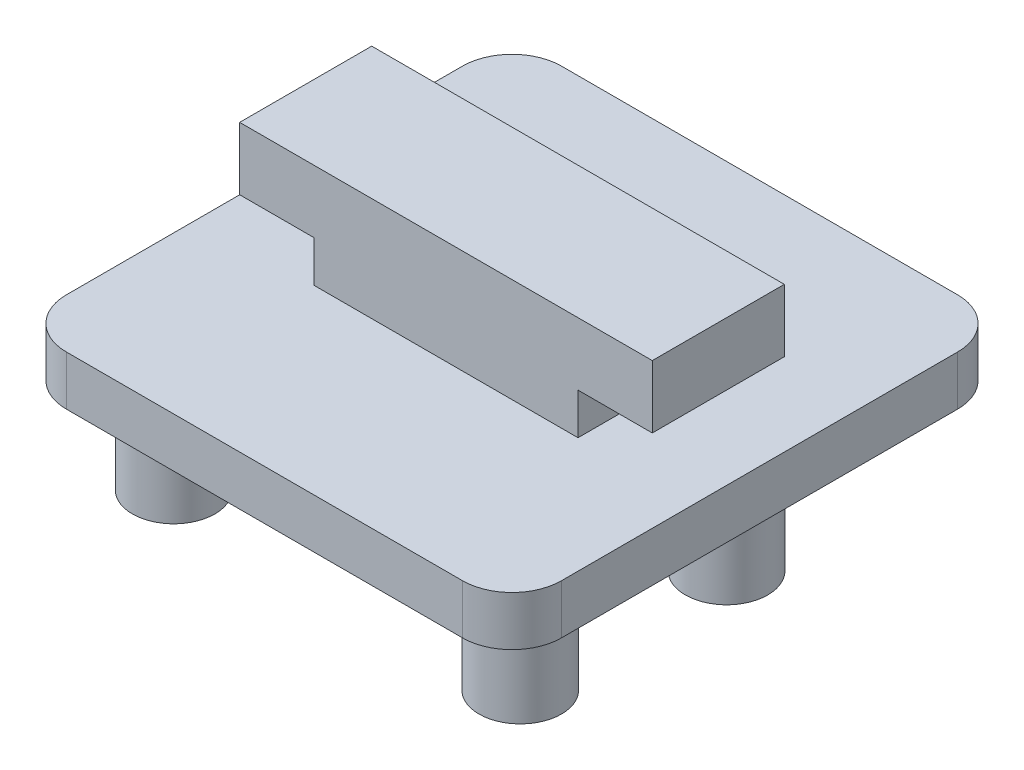
ISO-10303-21;
HEADER;
FILE_DESCRIPTION(('STEP AP214'),'2;1');
FILE_NAME('part.step','',(''),(''),'','','');
FILE_SCHEMA(('AUTOMOTIVE_DESIGN { 1 0 10303 214 1 1 1 1 }'));
ENDSEC;
DATA;
#1=APPLICATION_CONTEXT('core data for automotive mechanical design processes');
#2=APPLICATION_PROTOCOL_DEFINITION('international standard','automotive_design',2000,#1);
#3=PRODUCT_CONTEXT('',#1,'mechanical');
#4=PRODUCT('Part','Part','',(#3));
#5=PRODUCT_RELATED_PRODUCT_CATEGORY('part','',(#4));
#6=PRODUCT_DEFINITION_FORMATION('','',#4);
#7=PRODUCT_DEFINITION_CONTEXT('part definition',#1,'design');
#8=PRODUCT_DEFINITION('design','',#6,#7);
#9=PRODUCT_DEFINITION_SHAPE('','',#8);
#10=(LENGTH_UNIT() NAMED_UNIT(*) SI_UNIT(.MILLI.,.METRE.));
#11=(NAMED_UNIT(*) PLANE_ANGLE_UNIT() SI_UNIT($,.RADIAN.));
#12=(NAMED_UNIT(*) SI_UNIT($,.STERADIAN.) SOLID_ANGLE_UNIT());
#13=UNCERTAINTY_MEASURE_WITH_UNIT(LENGTH_MEASURE(1.E-05),#10,'distance_accuracy_value','');
#14=(GEOMETRIC_REPRESENTATION_CONTEXT(3) GLOBAL_UNCERTAINTY_ASSIGNED_CONTEXT((#13)) GLOBAL_UNIT_ASSIGNED_CONTEXT((#10,
#11,#12)) REPRESENTATION_CONTEXT('',''));
#15=CARTESIAN_POINT('',(0.,0.,0.));
#16=DIRECTION('',(0.,0.,1.));
#17=DIRECTION('',(1.,0.,0.));
#18=AXIS2_PLACEMENT_3D('',#15,#16,#17);
#19=CARTESIAN_POINT('',(2.92154730395577,3.,-2.83145688648393));
#20=DIRECTION('',(0.,-1.,0.));
#21=DIRECTION('',(0.,0.,-1.));
#22=AXIS2_PLACEMENT_3D('',#19,#20,#21);
#23=CYLINDRICAL_SURFACE('',#22,3.00000000000001);
#24=CARTESIAN_POINT('',(2.92154730395577,0.,-2.83145688648393));
#25=DIRECTION('',(0.,1.,0.));
#26=DIRECTION('',(0.,0.,1.));
#27=AXIS2_PLACEMENT_3D('',#24,#25,#26);
#28=CIRCLE('',#27,3.00000000000001);
#29=CARTESIAN_POINT('',(2.92154730395578,0.,0.168543113516079));
#30=VERTEX_POINT('',#29);
#31=CARTESIAN_POINT('',(5.92154730395578,0.,-2.83145688648392));
#32=VERTEX_POINT('',#31);
#33=EDGE_CURVE('E243',#30,#32,#28,.T.);
#34=ORIENTED_EDGE('',*,*,#33,.T.);
#35=DIRECTION('',(0.,-1.,0.));
#36=VECTOR('',#35,1.);
#37=CARTESIAN_POINT('',(5.92154730395578,3.,-2.83145688648392));
#38=LINE('',#37,#36);
#39=CARTESIAN_POINT('',(5.92154730395578,3.,-2.83145688648392));
#40=VERTEX_POINT('',#39);
#41=EDGE_CURVE('E300',#40,#32,#38,.T.);
#42=ORIENTED_EDGE('',*,*,#41,.F.);
#43=CARTESIAN_POINT('',(2.92154730395577,3.,-2.83145688648393));
#44=DIRECTION('',(0.,1.,0.));
#45=DIRECTION('',(0.,0.,1.));
#46=AXIS2_PLACEMENT_3D('',#43,#44,#45);
#47=CIRCLE('',#46,3.00000000000001);
#48=CARTESIAN_POINT('',(2.92154730395578,3.,0.168543113516079));
#49=VERTEX_POINT('',#48);
#50=EDGE_CURVE('E246',#49,#40,#47,.T.);
#51=ORIENTED_EDGE('',*,*,#50,.F.);
#52=DIRECTION('',(0.,-1.,0.));
#53=VECTOR('',#52,1.);
#54=CARTESIAN_POINT('',(2.92154730395578,3.,0.168543113516079));
#55=LINE('',#54,#53);
#56=EDGE_CURVE('E264',#49,#30,#55,.T.);
#57=ORIENTED_EDGE('',*,*,#56,.T.);
#58=EDGE_LOOP('',(#34,#42,#51,#57));
#59=FACE_BOUND('',#58,.T.);
#60=ADVANCED_FACE('F43',(#59),#23,.T.);
#61=CARTESIAN_POINT('',(5.92154730395578,3.,-2.83145688648392));
#62=DIRECTION('',(-1.,0.,0.));
#63=DIRECTION('',(0.,0.,1.));
#64=AXIS2_PLACEMENT_3D('',#61,#62,#63);
#65=PLANE('',#64);
#66=DIRECTION('',(0.,0.,-1.));
#67=VECTOR('',#66,1.);
#68=CARTESIAN_POINT('',(5.92154730395578,0.,-2.83145688648392));
#69=LINE('',#68,#67);
#70=CARTESIAN_POINT('',(5.92154730395578,0.,-26.8314568864839));
#71=VERTEX_POINT('',#70);
#72=EDGE_CURVE('E267',#32,#71,#69,.T.);
#73=ORIENTED_EDGE('',*,*,#72,.T.);
#74=DIRECTION('',(0.,-1.,0.));
#75=VECTOR('',#74,1.);
#76=CARTESIAN_POINT('',(5.92154730395578,3.,-26.8314568864839));
#77=LINE('',#76,#75);
#78=CARTESIAN_POINT('',(5.92154730395578,3.,-26.8314568864839));
#79=VERTEX_POINT('',#78);
#80=EDGE_CURVE('E297',#79,#71,#77,.T.);
#81=ORIENTED_EDGE('',*,*,#80,.F.);
#82=DIRECTION('',(0.,0.,-1.));
#83=VECTOR('',#82,1.);
#84=CARTESIAN_POINT('',(5.92154730395578,3.,-2.83145688648392));
#85=LINE('',#84,#83);
#86=EDGE_CURVE('E249',#40,#79,#85,.T.);
#87=ORIENTED_EDGE('',*,*,#86,.F.);
#88=ORIENTED_EDGE('',*,*,#41,.T.);
#89=EDGE_LOOP('',(#73,#81,#87,#88));
#90=FACE_BOUND('',#89,.T.);
#91=ADVANCED_FACE('F362',(#90),#65,.F.);
#92=CARTESIAN_POINT('',(2.92154730395577,3.,-26.8314568864839));
#93=DIRECTION('',(0.,-1.,0.));
#94=DIRECTION('',(0.,0.,-1.));
#95=AXIS2_PLACEMENT_3D('',#92,#93,#94);
#96=CYLINDRICAL_SURFACE('',#95,3.);
#97=CARTESIAN_POINT('',(2.92154730395577,0.,-26.8314568864839));
#98=DIRECTION('',(0.,1.,0.));
#99=DIRECTION('',(0.,0.,1.));
#100=AXIS2_PLACEMENT_3D('',#97,#98,#99);
#101=CIRCLE('',#100,3.);
#102=CARTESIAN_POINT('',(2.92154730395578,0.,-29.8314568864839));
#103=VERTEX_POINT('',#102);
#104=EDGE_CURVE('E269',#71,#103,#101,.T.);
#105=ORIENTED_EDGE('',*,*,#104,.T.);
#106=DIRECTION('',(0.,-1.,0.));
#107=VECTOR('',#106,1.);
#108=CARTESIAN_POINT('',(2.92154730395578,3.,-29.8314568864839));
#109=LINE('',#108,#107);
#110=CARTESIAN_POINT('',(2.92154730395578,3.,-29.8314568864839));
#111=VERTEX_POINT('',#110);
#112=EDGE_CURVE('E294',#111,#103,#109,.T.);
#113=ORIENTED_EDGE('',*,*,#112,.F.);
#114=CARTESIAN_POINT('',(2.92154730395577,3.,-26.8314568864839));
#115=DIRECTION('',(0.,1.,0.));
#116=DIRECTION('',(0.,0.,1.));
#117=AXIS2_PLACEMENT_3D('',#114,#115,#116);
#118=CIRCLE('',#117,3.);
#119=EDGE_CURVE('E252',#79,#111,#118,.T.);
#120=ORIENTED_EDGE('',*,*,#119,.F.);
#121=ORIENTED_EDGE('',*,*,#80,.T.);
#122=EDGE_LOOP('',(#105,#113,#120,#121));
#123=FACE_BOUND('',#122,.T.);
#124=ADVANCED_FACE('F358',(#123),#96,.T.);
#125=CARTESIAN_POINT('',(-21.0784526960442,3.,-29.8314568864839));
#126=DIRECTION('',(0.,0.,1.));
#127=DIRECTION('',(1.,0.,0.));
#128=AXIS2_PLACEMENT_3D('',#125,#126,#127);
#129=PLANE('',#128);
#130=DIRECTION('',(-1.,0.,0.));
#131=VECTOR('',#130,1.);
#132=CARTESIAN_POINT('',(-21.0784526960442,0.,-29.8314568864839));
#133=LINE('',#132,#131);
#134=CARTESIAN_POINT('',(-21.0784526960442,0.,-29.8314568864839));
#135=VERTEX_POINT('',#134);
#136=EDGE_CURVE('E271',#103,#135,#133,.T.);
#137=ORIENTED_EDGE('',*,*,#136,.T.);
#138=DIRECTION('',(0.,-1.,0.));
#139=VECTOR('',#138,1.);
#140=CARTESIAN_POINT('',(-21.0784526960442,3.,-29.8314568864839));
#141=LINE('',#140,#139);
#142=CARTESIAN_POINT('',(-21.0784526960442,3.,-29.8314568864839));
#143=VERTEX_POINT('',#142);
#144=EDGE_CURVE('E291',#143,#135,#141,.T.);
#145=ORIENTED_EDGE('',*,*,#144,.F.);
#146=DIRECTION('',(-1.,0.,0.));
#147=VECTOR('',#146,1.);
#148=CARTESIAN_POINT('',(-21.0784526960442,3.,-29.8314568864839));
#149=LINE('',#148,#147);
#150=EDGE_CURVE('E254',#111,#143,#149,.T.);
#151=ORIENTED_EDGE('',*,*,#150,.F.);
#152=ORIENTED_EDGE('',*,*,#112,.T.);
#153=EDGE_LOOP('',(#137,#145,#151,#152));
#154=FACE_BOUND('',#153,.T.);
#155=ADVANCED_FACE('F355',(#154),#129,.F.);
#156=CARTESIAN_POINT('',(-21.0784526960442,3.,-26.8314568864839));
#157=DIRECTION('',(0.,-1.,0.));
#158=DIRECTION('',(0.,0.,-1.));
#159=AXIS2_PLACEMENT_3D('',#156,#157,#158);
#160=CYLINDRICAL_SURFACE('',#159,3.);
#161=CARTESIAN_POINT('',(-21.0784526960442,0.,-26.8314568864839));
#162=DIRECTION('',(0.,1.,0.));
#163=DIRECTION('',(0.,0.,-1.));
#164=AXIS2_PLACEMENT_3D('',#161,#162,#163);
#165=CIRCLE('',#164,3.);
#166=CARTESIAN_POINT('',(-24.0784526960442,0.,-26.8314568864839));
#167=VERTEX_POINT('',#166);
#168=EDGE_CURVE('E273',#135,#167,#165,.T.);
#169=ORIENTED_EDGE('',*,*,#168,.T.);
#170=DIRECTION('',(0.,-1.,0.));
#171=VECTOR('',#170,1.);
#172=CARTESIAN_POINT('',(-24.0784526960442,3.,-26.8314568864839));
#173=LINE('',#172,#171);
#174=CARTESIAN_POINT('',(-24.0784526960442,3.,-26.8314568864839));
#175=VERTEX_POINT('',#174);
#176=EDGE_CURVE('E288',#175,#167,#173,.T.);
#177=ORIENTED_EDGE('',*,*,#176,.F.);
#178=CARTESIAN_POINT('',(-21.0784526960442,3.,-26.8314568864839));
#179=DIRECTION('',(0.,1.,0.));
#180=DIRECTION('',(0.,0.,-1.));
#181=AXIS2_PLACEMENT_3D('',#178,#179,#180);
#182=CIRCLE('',#181,3.);
#183=EDGE_CURVE('E256',#143,#175,#182,.T.);
#184=ORIENTED_EDGE('',*,*,#183,.F.);
#185=ORIENTED_EDGE('',*,*,#144,.T.);
#186=EDGE_LOOP('',(#169,#177,#184,#185));
#187=FACE_BOUND('',#186,.T.);
#188=ADVANCED_FACE('F351',(#187),#160,.T.);
#189=CARTESIAN_POINT('',(-24.0784526960442,3.,-26.8314568864839));
#190=DIRECTION('',(1.,0.,0.));
#191=DIRECTION('',(0.,0.,-1.));
#192=AXIS2_PLACEMENT_3D('',#189,#190,#191);
#193=PLANE('',#192);
#194=DIRECTION('',(0.,0.,1.));
#195=VECTOR('',#194,1.);
#196=CARTESIAN_POINT('',(-24.0784526960442,0.,-26.8314568864839));
#197=LINE('',#196,#195);
#198=CARTESIAN_POINT('',(-24.0784526960442,0.,-2.83145688648392));
#199=VERTEX_POINT('',#198);
#200=EDGE_CURVE('E275',#167,#199,#197,.T.);
#201=ORIENTED_EDGE('',*,*,#200,.T.);
#202=DIRECTION('',(0.,-1.,0.));
#203=VECTOR('',#202,1.);
#204=CARTESIAN_POINT('',(-24.0784526960442,3.,-2.83145688648392));
#205=LINE('',#204,#203);
#206=CARTESIAN_POINT('',(-24.0784526960442,3.,-2.83145688648392));
#207=VERTEX_POINT('',#206);
#208=EDGE_CURVE('E285',#207,#199,#205,.T.);
#209=ORIENTED_EDGE('',*,*,#208,.F.);
#210=DIRECTION('',(0.,0.,1.));
#211=VECTOR('',#210,1.);
#212=CARTESIAN_POINT('',(-24.0784526960442,3.,-26.8314568864839));
#213=LINE('',#212,#211);
#214=EDGE_CURVE('E258',#175,#207,#213,.T.);
#215=ORIENTED_EDGE('',*,*,#214,.F.);
#216=ORIENTED_EDGE('',*,*,#176,.T.);
#217=EDGE_LOOP('',(#201,#209,#215,#216));
#218=FACE_BOUND('',#217,.T.);
#219=ADVANCED_FACE('F346',(#218),#193,.F.);
#220=CARTESIAN_POINT('',(-21.0784526960442,3.,-2.83145688648393));
#221=DIRECTION('',(0.,-1.,0.));
#222=DIRECTION('',(0.,0.,-1.));
#223=AXIS2_PLACEMENT_3D('',#220,#221,#222);
#224=CYLINDRICAL_SURFACE('',#223,3.00000000000001);
#225=CARTESIAN_POINT('',(-21.0784526960442,0.,-2.83145688648393));
#226=DIRECTION('',(0.,1.,0.));
#227=DIRECTION('',(0.,0.,1.));
#228=AXIS2_PLACEMENT_3D('',#225,#226,#227);
#229=CIRCLE('',#228,3.00000000000001);
#230=CARTESIAN_POINT('',(-21.0784526960442,0.,0.168543113516078));
#231=VERTEX_POINT('',#230);
#232=EDGE_CURVE('E277',#199,#231,#229,.T.);
#233=ORIENTED_EDGE('',*,*,#232,.T.);
#234=DIRECTION('',(0.,-1.,0.));
#235=VECTOR('',#234,1.);
#236=CARTESIAN_POINT('',(-21.0784526960442,3.,0.168543113516078));
#237=LINE('',#236,#235);
#238=CARTESIAN_POINT('',(-21.0784526960442,3.,0.168543113516078));
#239=VERTEX_POINT('',#238);
#240=EDGE_CURVE('E282',#239,#231,#237,.T.);
#241=ORIENTED_EDGE('',*,*,#240,.F.);
#242=CARTESIAN_POINT('',(-21.0784526960442,3.,-2.83145688648393));
#243=DIRECTION('',(0.,1.,0.));
#244=DIRECTION('',(0.,0.,1.));
#245=AXIS2_PLACEMENT_3D('',#242,#243,#244);
#246=CIRCLE('',#245,3.00000000000001);
#247=EDGE_CURVE('E260',#207,#239,#246,.T.);
#248=ORIENTED_EDGE('',*,*,#247,.F.);
#249=ORIENTED_EDGE('',*,*,#208,.T.);
#250=EDGE_LOOP('',(#233,#241,#248,#249));
#251=FACE_BOUND('',#250,.T.);
#252=ADVANCED_FACE('F340',(#251),#224,.T.);
#253=CARTESIAN_POINT('',(-21.0784526960442,3.,0.168543113516079));
#254=DIRECTION('',(0.,0.,-1.));
#255=DIRECTION('',(-1.,0.,0.));
#256=AXIS2_PLACEMENT_3D('',#253,#254,#255);
#257=PLANE('',#256);
#258=DIRECTION('',(1.,0.,0.));
#259=VECTOR('',#258,1.);
#260=CARTESIAN_POINT('',(-21.0784526960442,0.,0.168543113516079));
#261=LINE('',#260,#259);
#262=EDGE_CURVE('E250',#231,#30,#261,.T.);
#263=ORIENTED_EDGE('',*,*,#262,.T.);
#264=ORIENTED_EDGE('',*,*,#56,.F.);
#265=DIRECTION('',(1.,0.,0.));
#266=VECTOR('',#265,1.);
#267=CARTESIAN_POINT('',(-21.0784526960442,3.,0.168543113516079));
#268=LINE('',#267,#266);
#269=EDGE_CURVE('E262',#239,#49,#268,.T.);
#270=ORIENTED_EDGE('',*,*,#269,.F.);
#271=ORIENTED_EDGE('',*,*,#240,.T.);
#272=EDGE_LOOP('',(#263,#264,#270,#271));
#273=FACE_BOUND('',#272,.T.);
#274=ADVANCED_FACE('F336',(#273),#257,.F.);
#275=CARTESIAN_POINT('',(2.92154730395577,3.,-2.83145688648393));
#276=DIRECTION('',(0.,1.,0.));
#277=DIRECTION('',(0.,0.,1.));
#278=AXIS2_PLACEMENT_3D('',#275,#276,#277);
#279=PLANE('',#278);
#280=DIRECTION('',(1.,0.,0.));
#281=VECTOR('',#280,1.);
#282=CARTESIAN_POINT('',(-1.07845269604421,3.,-10.8314568864839));
#283=LINE('',#282,#281);
#284=CARTESIAN_POINT('',(-17.0784526960442,3.,-10.8314568864839));
#285=VERTEX_POINT('',#284);
#286=CARTESIAN_POINT('',(-1.07845269604421,3.,-10.8314568864839));
#287=VERTEX_POINT('',#286);
#288=EDGE_CURVE('E57',#285,#287,#283,.T.);
#289=ORIENTED_EDGE('',*,*,#288,.F.);
#290=DIRECTION('',(0.,0.,1.));
#291=VECTOR('',#290,1.);
#292=CARTESIAN_POINT('',(-17.0784526960442,3.,-10.8314568864839));
#293=LINE('',#292,#291);
#294=CARTESIAN_POINT('',(-17.0784526960442,3.,-18.8314568864839));
#295=VERTEX_POINT('',#294);
#296=EDGE_CURVE('E61',#295,#285,#293,.T.);
#297=ORIENTED_EDGE('',*,*,#296,.F.);
#298=DIRECTION('',(-1.,0.,0.));
#299=VECTOR('',#298,1.);
#300=CARTESIAN_POINT('',(-17.0784526960442,3.,-18.8314568864839));
#301=LINE('',#300,#299);
#302=CARTESIAN_POINT('',(-1.07845269604422,3.,-18.8314568864839));
#303=VERTEX_POINT('',#302);
#304=EDGE_CURVE('E195',#303,#295,#301,.T.);
#305=ORIENTED_EDGE('',*,*,#304,.F.);
#306=DIRECTION('',(0.,0.,-1.));
#307=VECTOR('',#306,1.);
#308=CARTESIAN_POINT('',(-1.07845269604422,3.,-18.8314568864839));
#309=LINE('',#308,#307);
#310=EDGE_CURVE('E180',#287,#303,#309,.T.);
#311=ORIENTED_EDGE('',*,*,#310,.F.);
#312=EDGE_LOOP('',(#289,#297,#305,#311));
#313=FACE_BOUND('',#312,.T.);
#314=ORIENTED_EDGE('',*,*,#50,.T.);
#315=ORIENTED_EDGE('',*,*,#86,.T.);
#316=ORIENTED_EDGE('',*,*,#119,.T.);
#317=ORIENTED_EDGE('',*,*,#150,.T.);
#318=ORIENTED_EDGE('',*,*,#183,.T.);
#319=ORIENTED_EDGE('',*,*,#214,.T.);
#320=ORIENTED_EDGE('',*,*,#247,.T.);
#321=ORIENTED_EDGE('',*,*,#269,.T.);
#322=EDGE_LOOP('',(#314,#315,#316,#317,#318,#319,#320,#321));
#323=FACE_BOUND('',#322,.T.);
#324=ADVANCED_FACE('F317',(#313,#323),#279,.T.);
#325=CARTESIAN_POINT('',(2.92154730395577,0.,-2.83145688648393));
#326=DIRECTION('',(0.,1.,0.));
#327=DIRECTION('',(0.,0.,1.));
#328=AXIS2_PLACEMENT_3D('',#325,#326,#327);
#329=PLANE('',#328);
#330=CARTESIAN_POINT('',(-19.5784526960442,0.,-4.83145688648392));
#331=DIRECTION('',(0.,1.,0.));
#332=DIRECTION('',(0.,0.,1.));
#333=AXIS2_PLACEMENT_3D('',#330,#331,#332);
#334=CIRCLE('',#333,2.5);
#335=CARTESIAN_POINT('',(-19.5784526960442,0.,-2.33145688648392));
#336=VERTEX_POINT('',#335);
#337=EDGE_CURVE('E12',#336,#336,#334,.F.);
#338=ORIENTED_EDGE('',*,*,#337,.F.);
#339=EDGE_LOOP('',(#338));
#340=FACE_BOUND('',#339,.T.);
#341=CARTESIAN_POINT('',(1.42154730395578,0.,-17.3314568864839));
#342=DIRECTION('',(0.,1.,0.));
#343=DIRECTION('',(0.,0.,1.));
#344=AXIS2_PLACEMENT_3D('',#341,#342,#343);
#345=CIRCLE('',#344,2.5);
#346=CARTESIAN_POINT('',(1.42154730395578,0.,-14.8314568864839));
#347=VERTEX_POINT('',#346);
#348=EDGE_CURVE('E50',#347,#347,#345,.F.);
#349=ORIENTED_EDGE('',*,*,#348,.F.);
#350=EDGE_LOOP('',(#349));
#351=FACE_BOUND('',#350,.T.);
#352=CARTESIAN_POINT('',(-19.5784526960442,0.,-17.3314568864839));
#353=DIRECTION('',(0.,1.,0.));
#354=DIRECTION('',(0.,0.,1.));
#355=AXIS2_PLACEMENT_3D('',#352,#353,#354);
#356=CIRCLE('',#355,2.5);
#357=CARTESIAN_POINT('',(-19.5784526960442,0.,-14.8314568864839));
#358=VERTEX_POINT('',#357);
#359=EDGE_CURVE('E306',#358,#358,#356,.F.);
#360=ORIENTED_EDGE('',*,*,#359,.F.);
#361=EDGE_LOOP('',(#360));
#362=FACE_BOUND('',#361,.T.);
#363=CARTESIAN_POINT('',(1.42154730395578,0.,-4.83145688648392));
#364=DIRECTION('',(0.,1.,0.));
#365=DIRECTION('',(0.,0.,1.));
#366=AXIS2_PLACEMENT_3D('',#363,#364,#365);
#367=CIRCLE('',#366,2.5);
#368=CARTESIAN_POINT('',(1.42154730395578,0.,-2.33145688648392));
#369=VERTEX_POINT('',#368);
#370=EDGE_CURVE('E303',#369,#369,#367,.F.);
#371=ORIENTED_EDGE('',*,*,#370,.F.);
#372=EDGE_LOOP('',(#371));
#373=FACE_BOUND('',#372,.T.);
#374=ORIENTED_EDGE('',*,*,#33,.F.);
#375=ORIENTED_EDGE('',*,*,#262,.F.);
#376=ORIENTED_EDGE('',*,*,#232,.F.);
#377=ORIENTED_EDGE('',*,*,#200,.F.);
#378=ORIENTED_EDGE('',*,*,#168,.F.);
#379=ORIENTED_EDGE('',*,*,#136,.F.);
#380=ORIENTED_EDGE('',*,*,#104,.F.);
#381=ORIENTED_EDGE('',*,*,#72,.F.);
#382=EDGE_LOOP('',(#374,#375,#376,#377,#378,#379,#380,#381));
#383=FACE_BOUND('',#382,.T.);
#384=ADVANCED_FACE('F313',(#340,#351,#362,#373,#383),#329,.F.);
#385=CARTESIAN_POINT('',(1.42154730395578,-6.,-4.83145688648392));
#386=DIRECTION('',(0.,1.,0.));
#387=DIRECTION('',(0.,0.,1.));
#388=AXIS2_PLACEMENT_3D('',#385,#386,#387);
#389=CYLINDRICAL_SURFACE('',#388,0.95);
#390=CARTESIAN_POINT('',(1.42154730395578,-6.,-4.83145688648392));
#391=DIRECTION('',(0.,-1.,0.));
#392=DIRECTION('',(0.,0.,-1.));
#393=AXIS2_PLACEMENT_3D('',#390,#391,#392);
#394=CIRCLE('',#393,0.95);
#395=CARTESIAN_POINT('',(1.42154730395578,-6.,-5.78145688648392));
#396=VERTEX_POINT('',#395);
#397=EDGE_CURVE('E237',#396,#396,#394,.T.);
#398=ORIENTED_EDGE('',*,*,#397,.T.);
#399=EDGE_LOOP('',(#398));
#400=FACE_BOUND('',#399,.T.);
#401=CARTESIAN_POINT('',(1.42154730395578,0.,-4.83145688648392));
#402=DIRECTION('',(0.,-1.,0.));
#403=DIRECTION('',(0.,0.,-1.));
#404=AXIS2_PLACEMENT_3D('',#401,#402,#403);
#405=CIRCLE('',#404,0.95);
#406=CARTESIAN_POINT('',(1.42154730395578,0.,-5.78145688648392));
#407=VERTEX_POINT('',#406);
#408=EDGE_CURVE('E231',#407,#407,#405,.T.);
#409=ORIENTED_EDGE('',*,*,#408,.F.);
#410=EDGE_LOOP('',(#409));
#411=FACE_BOUND('',#410,.T.);
#412=ADVANCED_FACE('F316',(#400,#411),#389,.F.);
#413=CARTESIAN_POINT('',(1.42154730395578,-6.,-4.83145688648392));
#414=DIRECTION('',(0.,1.,0.));
#415=DIRECTION('',(0.,0.,1.));
#416=AXIS2_PLACEMENT_3D('',#413,#414,#415);
#417=CYLINDRICAL_SURFACE('',#416,2.5);
#418=CARTESIAN_POINT('',(1.42154730395578,-6.,-4.83145688648392));
#419=DIRECTION('',(0.,-1.,0.));
#420=DIRECTION('',(0.,0.,-1.));
#421=AXIS2_PLACEMENT_3D('',#418,#419,#420);
#422=CIRCLE('',#421,2.5);
#423=CARTESIAN_POINT('',(1.42154730395578,-6.,-7.33145688648392));
#424=VERTEX_POINT('',#423);
#425=EDGE_CURVE('E240',#424,#424,#422,.T.);
#426=ORIENTED_EDGE('',*,*,#425,.F.);
#427=EDGE_LOOP('',(#426));
#428=FACE_BOUND('',#427,.T.);
#429=ORIENTED_EDGE('',*,*,#370,.T.);
#430=EDGE_LOOP('',(#429));
#431=FACE_BOUND('',#430,.T.);
#432=ADVANCED_FACE('F412',(#428,#431),#417,.T.);
#433=CARTESIAN_POINT('',(0.,-6.,0.));
#434=DIRECTION('',(0.,-1.,0.));
#435=DIRECTION('',(0.,0.,-1.));
#436=AXIS2_PLACEMENT_3D('',#433,#434,#435);
#437=PLANE('',#436);
#438=ORIENTED_EDGE('',*,*,#397,.F.);
#439=EDGE_LOOP('',(#438));
#440=FACE_BOUND('',#439,.T.);
#441=ORIENTED_EDGE('',*,*,#425,.T.);
#442=EDGE_LOOP('',(#441));
#443=FACE_BOUND('',#442,.T.);
#444=ADVANCED_FACE('F422',(#440,#443),#437,.T.);
#445=ORIENTED_EDGE('',*,*,#408,.T.);
#446=EDGE_LOOP('',(#445));
#447=FACE_BOUND('',#446,.T.);
#448=ADVANCED_FACE('F321',(#447),#329,.F.);
#449=CARTESIAN_POINT('',(-19.5784526960442,-6.,-17.3314568864839));
#450=DIRECTION('',(0.,1.,0.));
#451=DIRECTION('',(0.,0.,1.));
#452=AXIS2_PLACEMENT_3D('',#449,#450,#451);
#453=CYLINDRICAL_SURFACE('',#452,0.950000000000001);
#454=CARTESIAN_POINT('',(-19.5784526960442,-6.,-17.3314568864839));
#455=DIRECTION('',(0.,-1.,0.));
#456=DIRECTION('',(0.,0.,-1.));
#457=AXIS2_PLACEMENT_3D('',#454,#455,#456);
#458=CIRCLE('',#457,0.950000000000001);
#459=CARTESIAN_POINT('',(-19.5784526960442,-6.,-18.2814568864839));
#460=VERTEX_POINT('',#459);
#461=EDGE_CURVE('E232',#460,#460,#458,.T.);
#462=ORIENTED_EDGE('',*,*,#461,.T.);
#463=EDGE_LOOP('',(#462));
#464=FACE_BOUND('',#463,.T.);
#465=CARTESIAN_POINT('',(-19.5784526960442,0.,-17.3314568864839));
#466=DIRECTION('',(0.,-1.,0.));
#467=DIRECTION('',(0.,0.,-1.));
#468=AXIS2_PLACEMENT_3D('',#465,#466,#467);
#469=CIRCLE('',#468,0.950000000000001);
#470=CARTESIAN_POINT('',(-19.5784526960442,0.,-18.2814568864839));
#471=VERTEX_POINT('',#470);
#472=EDGE_CURVE('E228',#471,#471,#469,.T.);
#473=ORIENTED_EDGE('',*,*,#472,.F.);
#474=EDGE_LOOP('',(#473));
#475=FACE_BOUND('',#474,.T.);
#476=ADVANCED_FACE('F441',(#464,#475),#453,.F.);
#477=CARTESIAN_POINT('',(-19.5784526960442,-6.,-17.3314568864839));
#478=DIRECTION('',(0.,1.,0.));
#479=DIRECTION('',(0.,0.,1.));
#480=AXIS2_PLACEMENT_3D('',#477,#478,#479);
#481=CYLINDRICAL_SURFACE('',#480,2.5);
#482=CARTESIAN_POINT('',(-19.5784526960442,-6.,-17.3314568864839));
#483=DIRECTION('',(0.,-1.,0.));
#484=DIRECTION('',(0.,0.,-1.));
#485=AXIS2_PLACEMENT_3D('',#482,#483,#484);
#486=CIRCLE('',#485,2.5);
#487=CARTESIAN_POINT('',(-19.5784526960442,-6.,-19.8314568864839));
#488=VERTEX_POINT('',#487);
#489=EDGE_CURVE('E222',#488,#488,#486,.T.);
#490=ORIENTED_EDGE('',*,*,#489,.F.);
#491=EDGE_LOOP('',(#490));
#492=FACE_BOUND('',#491,.T.);
#493=ORIENTED_EDGE('',*,*,#359,.T.);
#494=EDGE_LOOP('',(#493));
#495=FACE_BOUND('',#494,.T.);
#496=ADVANCED_FACE('F451',(#492,#495),#481,.T.);
#497=CARTESIAN_POINT('',(0.,-6.,0.));
#498=DIRECTION('',(0.,-1.,0.));
#499=DIRECTION('',(0.,0.,-1.));
#500=AXIS2_PLACEMENT_3D('',#497,#498,#499);
#501=PLANE('',#500);
#502=ORIENTED_EDGE('',*,*,#461,.F.);
#503=EDGE_LOOP('',(#502));
#504=FACE_BOUND('',#503,.T.);
#505=ORIENTED_EDGE('',*,*,#489,.T.);
#506=EDGE_LOOP('',(#505));
#507=FACE_BOUND('',#506,.T.);
#508=ADVANCED_FACE('F461',(#504,#507),#501,.T.);
#509=ORIENTED_EDGE('',*,*,#472,.T.);
#510=EDGE_LOOP('',(#509));
#511=FACE_BOUND('',#510,.T.);
#512=ADVANCED_FACE('F443',(#511),#329,.F.);
#513=CARTESIAN_POINT('',(1.42154730395578,-6.,-17.3314568864839));
#514=DIRECTION('',(0.,1.,0.));
#515=DIRECTION('',(0.,0.,1.));
#516=AXIS2_PLACEMENT_3D('',#513,#514,#515);
#517=CYLINDRICAL_SURFACE('',#516,0.95);
#518=CARTESIAN_POINT('',(1.42154730395578,-6.,-17.3314568864839));
#519=DIRECTION('',(0.,-1.,0.));
#520=DIRECTION('',(0.,0.,-1.));
#521=AXIS2_PLACEMENT_3D('',#518,#519,#520);
#522=CIRCLE('',#521,0.95);
#523=CARTESIAN_POINT('',(1.42154730395578,-6.,-18.2814568864839));
#524=VERTEX_POINT('',#523);
#525=EDGE_CURVE('E223',#524,#524,#522,.T.);
#526=ORIENTED_EDGE('',*,*,#525,.T.);
#527=EDGE_LOOP('',(#526));
#528=FACE_BOUND('',#527,.T.);
#529=CARTESIAN_POINT('',(1.42154730395578,0.,-17.3314568864839));
#530=DIRECTION('',(0.,-1.,0.));
#531=DIRECTION('',(0.,0.,-1.));
#532=AXIS2_PLACEMENT_3D('',#529,#530,#531);
#533=CIRCLE('',#532,0.95);
#534=CARTESIAN_POINT('',(1.42154730395578,0.,-18.2814568864839));
#535=VERTEX_POINT('',#534);
#536=EDGE_CURVE('E219',#535,#535,#533,.T.);
#537=ORIENTED_EDGE('',*,*,#536,.F.);
#538=EDGE_LOOP('',(#537));
#539=FACE_BOUND('',#538,.T.);
#540=ADVANCED_FACE('F480',(#528,#539),#517,.F.);
#541=CARTESIAN_POINT('',(1.42154730395578,-6.,-17.3314568864839));
#542=DIRECTION('',(0.,1.,0.));
#543=DIRECTION('',(0.,0.,1.));
#544=AXIS2_PLACEMENT_3D('',#541,#542,#543);
#545=CYLINDRICAL_SURFACE('',#544,2.5);
#546=CARTESIAN_POINT('',(1.42154730395578,-6.,-17.3314568864839));
#547=DIRECTION('',(0.,-1.,0.));
#548=DIRECTION('',(0.,0.,-1.));
#549=AXIS2_PLACEMENT_3D('',#546,#547,#548);
#550=CIRCLE('',#549,2.5);
#551=CARTESIAN_POINT('',(1.42154730395578,-6.,-19.8314568864839));
#552=VERTEX_POINT('',#551);
#553=EDGE_CURVE('E216',#552,#552,#550,.T.);
#554=ORIENTED_EDGE('',*,*,#553,.F.);
#555=EDGE_LOOP('',(#554));
#556=FACE_BOUND('',#555,.T.);
#557=ORIENTED_EDGE('',*,*,#348,.T.);
#558=EDGE_LOOP('',(#557));
#559=FACE_BOUND('',#558,.T.);
#560=ADVANCED_FACE('F311',(#556,#559),#545,.T.);
#561=CARTESIAN_POINT('',(0.,-6.,0.));
#562=DIRECTION('',(0.,-1.,0.));
#563=DIRECTION('',(0.,0.,-1.));
#564=AXIS2_PLACEMENT_3D('',#561,#562,#563);
#565=PLANE('',#564);
#566=ORIENTED_EDGE('',*,*,#525,.F.);
#567=EDGE_LOOP('',(#566));
#568=FACE_BOUND('',#567,.T.);
#569=ORIENTED_EDGE('',*,*,#553,.T.);
#570=EDGE_LOOP('',(#569));
#571=FACE_BOUND('',#570,.T.);
#572=ADVANCED_FACE('F499',(#568,#571),#565,.T.);
#573=ORIENTED_EDGE('',*,*,#536,.T.);
#574=EDGE_LOOP('',(#573));
#575=FACE_BOUND('',#574,.T.);
#576=ADVANCED_FACE('F482',(#575),#329,.F.);
#577=CARTESIAN_POINT('',(-19.5784526960442,-6.,-4.83145688648392));
#578=DIRECTION('',(0.,-1.,0.));
#579=DIRECTION('',(0.,0.,-1.));
#580=AXIS2_PLACEMENT_3D('',#577,#578,#579);
#581=PLANE('',#580);
#582=CARTESIAN_POINT('',(-19.5784526960442,-6.,-4.83145688648392));
#583=DIRECTION('',(0.,-1.,0.));
#584=DIRECTION('',(0.,0.,-1.));
#585=AXIS2_PLACEMENT_3D('',#582,#583,#584);
#586=CIRCLE('',#585,2.5);
#587=CARTESIAN_POINT('',(-19.5784526960442,-6.,-7.33145688648392));
#588=VERTEX_POINT('',#587);
#589=EDGE_CURVE('E209',#588,#588,#586,.T.);
#590=ORIENTED_EDGE('',*,*,#589,.T.);
#591=EDGE_LOOP('',(#590));
#592=FACE_BOUND('',#591,.T.);
#593=CARTESIAN_POINT('',(-19.5784526960442,-6.,-4.83145688648392));
#594=DIRECTION('',(0.,-1.,0.));
#595=DIRECTION('',(0.,0.,-1.));
#596=AXIS2_PLACEMENT_3D('',#593,#594,#595);
#597=CIRCLE('',#596,0.973149492321348);
#598=CARTESIAN_POINT('',(-19.5784526960442,-6.,-5.80460637880527));
#599=VERTEX_POINT('',#598);
#600=EDGE_CURVE('E212',#599,#599,#597,.T.);
#601=ORIENTED_EDGE('',*,*,#600,.F.);
#602=EDGE_LOOP('',(#601));
#603=FACE_BOUND('',#602,.T.);
#604=ADVANCED_FACE('F518',(#592,#603),#581,.T.);
#605=CARTESIAN_POINT('',(-19.5784526960442,-6.,-4.83145688648392));
#606=DIRECTION('',(0.,1.,0.));
#607=DIRECTION('',(0.,0.,1.));
#608=AXIS2_PLACEMENT_3D('',#605,#606,#607);
#609=CYLINDRICAL_SURFACE('',#608,2.5);
#610=ORIENTED_EDGE('',*,*,#589,.F.);
#611=EDGE_LOOP('',(#610));
#612=FACE_BOUND('',#611,.T.);
#613=ORIENTED_EDGE('',*,*,#337,.T.);
#614=EDGE_LOOP('',(#613));
#615=FACE_BOUND('',#614,.T.);
#616=ADVANCED_FACE('F526',(#612,#615),#609,.T.);
#617=CARTESIAN_POINT('',(-19.5784526960442,-6.,-4.83145688648392));
#618=DIRECTION('',(0.,1.,0.));
#619=DIRECTION('',(0.,0.,1.));
#620=AXIS2_PLACEMENT_3D('',#617,#618,#619);
#621=CYLINDRICAL_SURFACE('',#620,0.973149492321348);
#622=ORIENTED_EDGE('',*,*,#600,.T.);
#623=EDGE_LOOP('',(#622));
#624=FACE_BOUND('',#623,.T.);
#625=CARTESIAN_POINT('',(-19.5784526960442,0.,-4.83145688648392));
#626=DIRECTION('',(0.,-1.,0.));
#627=DIRECTION('',(0.,0.,-1.));
#628=AXIS2_PLACEMENT_3D('',#625,#626,#627);
#629=CIRCLE('',#628,0.973149492321348);
#630=CARTESIAN_POINT('',(-19.5784526960442,0.,-5.80460637880527));
#631=VERTEX_POINT('',#630);
#632=EDGE_CURVE('E213',#631,#631,#629,.T.);
#633=ORIENTED_EDGE('',*,*,#632,.F.);
#634=EDGE_LOOP('',(#633));
#635=FACE_BOUND('',#634,.T.);
#636=ADVANCED_FACE('F536',(#624,#635),#621,.F.);
#637=ORIENTED_EDGE('',*,*,#632,.T.);
#638=EDGE_LOOP('',(#637));
#639=FACE_BOUND('',#638,.T.);
#640=ADVANCED_FACE('F320',(#639),#329,.F.);
#641=CARTESIAN_POINT('',(-1.07845269604421,5.5,-10.8314568864839));
#642=DIRECTION('',(0.,0.,-1.));
#643=DIRECTION('',(-1.,0.,0.));
#644=AXIS2_PLACEMENT_3D('',#641,#642,#643);
#645=PLANE('',#644);
#646=ORIENTED_EDGE('',*,*,#288,.T.);
#647=DIRECTION('',(0.,-1.,0.));
#648=VECTOR('',#647,1.);
#649=CARTESIAN_POINT('',(-1.07845269604421,5.5,-10.8314568864839));
#650=LINE('',#649,#648);
#651=CARTESIAN_POINT('',(-1.07845269604421,5.5,-10.8314568864839));
#652=VERTEX_POINT('',#651);
#653=EDGE_CURVE('E206',#652,#287,#650,.T.);
#654=ORIENTED_EDGE('',*,*,#653,.F.);
#655=DIRECTION('',(1.,0.,0.));
#656=VECTOR('',#655,1.);
#657=CARTESIAN_POINT('',(-21.5784526960442,5.5,-10.8314568864839));
#658=LINE('',#657,#656);
#659=CARTESIAN_POINT('',(3.42154730395578,5.5,-10.8314568864839));
#660=VERTEX_POINT('',#659);
#661=EDGE_CURVE('E652',#652,#660,#658,.T.);
#662=ORIENTED_EDGE('',*,*,#661,.T.);
#663=DIRECTION('',(0.,-1.,0.));
#664=VECTOR('',#663,1.);
#665=CARTESIAN_POINT('',(3.42154730395578,9.3,-10.8314568864839));
#666=LINE('',#665,#664);
#667=CARTESIAN_POINT('',(3.42154730395578,9.3,-10.8314568864839));
#668=VERTEX_POINT('',#667);
#669=EDGE_CURVE('E656',#668,#660,#666,.T.);
#670=ORIENTED_EDGE('',*,*,#669,.F.);
#671=DIRECTION('',(1.,0.,0.));
#672=VECTOR('',#671,1.);
#673=CARTESIAN_POINT('',(-21.5784526960442,9.3,-10.8314568864839));
#674=LINE('',#673,#672);
#675=CARTESIAN_POINT('',(-21.5784526960442,9.3,-10.8314568864839));
#676=VERTEX_POINT('',#675);
#677=EDGE_CURVE('E170',#676,#668,#674,.T.);
#678=ORIENTED_EDGE('',*,*,#677,.F.);
#679=DIRECTION('',(0.,-1.,0.));
#680=VECTOR('',#679,1.);
#681=CARTESIAN_POINT('',(-21.5784526960442,9.3,-10.8314568864839));
#682=LINE('',#681,#680);
#683=CARTESIAN_POINT('',(-21.5784526960442,5.5,-10.8314568864839));
#684=VERTEX_POINT('',#683);
#685=EDGE_CURVE('E182',#676,#684,#682,.T.);
#686=ORIENTED_EDGE('',*,*,#685,.T.);
#687=CARTESIAN_POINT('',(-17.0784526960442,5.5,-10.8314568864839));
#688=VERTEX_POINT('',#687);
#689=EDGE_CURVE('E174',#684,#688,#658,.T.);
#690=ORIENTED_EDGE('',*,*,#689,.T.);
#691=DIRECTION('',(0.,-1.,0.));
#692=VECTOR('',#691,1.);
#693=CARTESIAN_POINT('',(-17.0784526960442,5.5,-10.8314568864839));
#694=LINE('',#693,#692);
#695=EDGE_CURVE('E191',#688,#285,#694,.T.);
#696=ORIENTED_EDGE('',*,*,#695,.T.);
#697=EDGE_LOOP('',(#646,#654,#662,#670,#678,#686,#690,#696));
#698=FACE_BOUND('',#697,.T.);
#699=ADVANCED_FACE('F554',(#698),#645,.F.);
#700=CARTESIAN_POINT('',(-1.07845269604422,5.5,-18.8314568864839));
#701=DIRECTION('',(-1.,0.,0.));
#702=DIRECTION('',(0.,0.,1.));
#703=AXIS2_PLACEMENT_3D('',#700,#701,#702);
#704=PLANE('',#703);
#705=ORIENTED_EDGE('',*,*,#310,.T.);
#706=DIRECTION('',(0.,-1.,0.));
#707=VECTOR('',#706,1.);
#708=CARTESIAN_POINT('',(-1.07845269604422,5.5,-18.8314568864839));
#709=LINE('',#708,#707);
#710=CARTESIAN_POINT('',(-1.07845269604422,5.5,-18.8314568864839));
#711=VERTEX_POINT('',#710);
#712=EDGE_CURVE('E203',#711,#303,#709,.T.);
#713=ORIENTED_EDGE('',*,*,#712,.F.);
#714=DIRECTION('',(0.,0.,-1.));
#715=VECTOR('',#714,1.);
#716=CARTESIAN_POINT('',(-1.07845269604422,5.5,-18.8314568864839));
#717=LINE('',#716,#715);
#718=EDGE_CURVE('E186',#652,#711,#717,.T.);
#719=ORIENTED_EDGE('',*,*,#718,.F.);
#720=ORIENTED_EDGE('',*,*,#653,.T.);
#721=EDGE_LOOP('',(#705,#713,#719,#720));
#722=FACE_BOUND('',#721,.T.);
#723=ADVANCED_FACE('F567',(#722),#704,.F.);
#724=CARTESIAN_POINT('',(-17.0784526960442,5.5,-18.8314568864839));
#725=DIRECTION('',(0.,0.,1.));
#726=DIRECTION('',(1.,0.,0.));
#727=AXIS2_PLACEMENT_3D('',#724,#725,#726);
#728=PLANE('',#727);
#729=ORIENTED_EDGE('',*,*,#304,.T.);
#730=DIRECTION('',(0.,-1.,0.));
#731=VECTOR('',#730,1.);
#732=CARTESIAN_POINT('',(-17.0784526960442,5.5,-18.8314568864839));
#733=LINE('',#732,#731);
#734=CARTESIAN_POINT('',(-17.0784526960442,5.5,-18.8314568864839));
#735=VERTEX_POINT('',#734);
#736=EDGE_CURVE('E200',#735,#295,#733,.T.);
#737=ORIENTED_EDGE('',*,*,#736,.F.);
#738=DIRECTION('',(-1.,0.,0.));
#739=VECTOR('',#738,1.);
#740=CARTESIAN_POINT('',(-9.07845269604422,5.5,-18.8314568864839));
#741=LINE('',#740,#739);
#742=CARTESIAN_POINT('',(-21.5784526960442,5.5,-18.8314568864839));
#743=VERTEX_POINT('',#742);
#744=EDGE_CURVE('E664',#735,#743,#741,.T.);
#745=ORIENTED_EDGE('',*,*,#744,.T.);
#746=DIRECTION('',(0.,-1.,0.));
#747=VECTOR('',#746,1.);
#748=CARTESIAN_POINT('',(-21.5784526960442,9.3,-18.8314568864839));
#749=LINE('',#748,#747);
#750=CARTESIAN_POINT('',(-21.5784526960442,9.3,-18.8314568864839));
#751=VERTEX_POINT('',#750);
#752=EDGE_CURVE('E161',#751,#743,#749,.T.);
#753=ORIENTED_EDGE('',*,*,#752,.F.);
#754=DIRECTION('',(-1.,0.,0.));
#755=VECTOR('',#754,1.);
#756=CARTESIAN_POINT('',(3.42154730395578,9.3,-18.8314568864839));
#757=LINE('',#756,#755);
#758=CARTESIAN_POINT('',(3.42154730395578,9.3,-18.8314568864839));
#759=VERTEX_POINT('',#758);
#760=EDGE_CURVE('E153',#759,#751,#757,.T.);
#761=ORIENTED_EDGE('',*,*,#760,.F.);
#762=DIRECTION('',(0.,-1.,0.));
#763=VECTOR('',#762,1.);
#764=CARTESIAN_POINT('',(3.42154730395578,9.3,-18.8314568864839));
#765=LINE('',#764,#763);
#766=CARTESIAN_POINT('',(3.42154730395578,5.5,-18.8314568864839));
#767=VERTEX_POINT('',#766);
#768=EDGE_CURVE('E158',#759,#767,#765,.T.);
#769=ORIENTED_EDGE('',*,*,#768,.T.);
#770=EDGE_CURVE('E653',#767,#711,#741,.T.);
#771=ORIENTED_EDGE('',*,*,#770,.T.);
#772=ORIENTED_EDGE('',*,*,#712,.T.);
#773=EDGE_LOOP('',(#729,#737,#745,#753,#761,#769,#771,#772));
#774=FACE_BOUND('',#773,.T.);
#775=ADVANCED_FACE('F155',(#774),#728,.F.);
#776=CARTESIAN_POINT('',(-17.0784526960442,5.5,-10.8314568864839));
#777=DIRECTION('',(1.,0.,0.));
#778=DIRECTION('',(0.,0.,-1.));
#779=AXIS2_PLACEMENT_3D('',#776,#777,#778);
#780=PLANE('',#779);
#781=ORIENTED_EDGE('',*,*,#296,.T.);
#782=ORIENTED_EDGE('',*,*,#695,.F.);
#783=DIRECTION('',(0.,0.,1.));
#784=VECTOR('',#783,1.);
#785=CARTESIAN_POINT('',(-17.0784526960442,5.5,-10.8314568864839));
#786=LINE('',#785,#784);
#787=EDGE_CURVE('E189',#735,#688,#786,.T.);
#788=ORIENTED_EDGE('',*,*,#787,.F.);
#789=ORIENTED_EDGE('',*,*,#736,.T.);
#790=EDGE_LOOP('',(#781,#782,#788,#789));
#791=FACE_BOUND('',#790,.T.);
#792=ADVANCED_FACE('F589',(#791),#780,.F.);
#793=CARTESIAN_POINT('',(0.,5.5,0.));
#794=DIRECTION('',(0.,1.,0.));
#795=DIRECTION('',(0.,0.,1.));
#796=AXIS2_PLACEMENT_3D('',#793,#794,#795);
#797=PLANE('',#796);
#798=ORIENTED_EDGE('',*,*,#661,.F.);
#799=ORIENTED_EDGE('',*,*,#718,.T.);
#800=ORIENTED_EDGE('',*,*,#770,.F.);
#801=DIRECTION('',(0.,0.,-1.));
#802=VECTOR('',#801,1.);
#803=CARTESIAN_POINT('',(3.42154730395578,5.5,-10.8314568864839));
#804=LINE('',#803,#802);
#805=EDGE_CURVE('E178',#660,#767,#804,.T.);
#806=ORIENTED_EDGE('',*,*,#805,.F.);
#807=EDGE_LOOP('',(#798,#799,#800,#806));
#808=FACE_BOUND('',#807,.T.);
#809=ADVANCED_FACE('F598',(#808),#797,.F.);
#810=ORIENTED_EDGE('',*,*,#744,.F.);
#811=ORIENTED_EDGE('',*,*,#787,.T.);
#812=ORIENTED_EDGE('',*,*,#689,.F.);
#813=DIRECTION('',(0.,0.,1.));
#814=VECTOR('',#813,1.);
#815=CARTESIAN_POINT('',(-21.5784526960442,5.5,-18.8314568864839));
#816=LINE('',#815,#814);
#817=EDGE_CURVE('E648',#743,#684,#816,.T.);
#818=ORIENTED_EDGE('',*,*,#817,.F.);
#819=EDGE_LOOP('',(#810,#811,#812,#818));
#820=FACE_BOUND('',#819,.T.);
#821=ADVANCED_FACE('F607',(#820),#797,.F.);
#822=CARTESIAN_POINT('',(3.42154730395578,9.3,-10.8314568864839));
#823=DIRECTION('',(-1.,0.,0.));
#824=DIRECTION('',(0.,0.,1.));
#825=AXIS2_PLACEMENT_3D('',#822,#823,#824);
#826=PLANE('',#825);
#827=ORIENTED_EDGE('',*,*,#805,.T.);
#828=ORIENTED_EDGE('',*,*,#768,.F.);
#829=DIRECTION('',(0.,0.,-1.));
#830=VECTOR('',#829,1.);
#831=CARTESIAN_POINT('',(3.42154730395578,9.3,-10.8314568864839));
#832=LINE('',#831,#830);
#833=EDGE_CURVE('E165',#668,#759,#832,.T.);
#834=ORIENTED_EDGE('',*,*,#833,.F.);
#835=ORIENTED_EDGE('',*,*,#669,.T.);
#836=EDGE_LOOP('',(#827,#828,#834,#835));
#837=FACE_BOUND('',#836,.T.);
#838=ADVANCED_FACE('F176',(#837),#826,.F.);
#839=CARTESIAN_POINT('',(-21.5784526960442,9.3,-18.8314568864839));
#840=DIRECTION('',(1.,0.,0.));
#841=DIRECTION('',(0.,0.,-1.));
#842=AXIS2_PLACEMENT_3D('',#839,#840,#841);
#843=PLANE('',#842);
#844=ORIENTED_EDGE('',*,*,#817,.T.);
#845=ORIENTED_EDGE('',*,*,#685,.F.);
#846=DIRECTION('',(0.,0.,1.));
#847=VECTOR('',#846,1.);
#848=CARTESIAN_POINT('',(-21.5784526960442,9.3,-18.8314568864839));
#849=LINE('',#848,#847);
#850=EDGE_CURVE('E164',#751,#676,#849,.T.);
#851=ORIENTED_EDGE('',*,*,#850,.F.);
#852=ORIENTED_EDGE('',*,*,#752,.T.);
#853=EDGE_LOOP('',(#844,#845,#851,#852));
#854=FACE_BOUND('',#853,.T.);
#855=ADVANCED_FACE('F625',(#854),#843,.F.);
#856=CARTESIAN_POINT('',(0.,9.3,0.));
#857=DIRECTION('',(0.,1.,0.));
#858=DIRECTION('',(0.,0.,1.));
#859=AXIS2_PLACEMENT_3D('',#856,#857,#858);
#860=PLANE('',#859);
#861=ORIENTED_EDGE('',*,*,#833,.T.);
#862=ORIENTED_EDGE('',*,*,#760,.T.);
#863=ORIENTED_EDGE('',*,*,#850,.T.);
#864=ORIENTED_EDGE('',*,*,#677,.T.);
#865=EDGE_LOOP('',(#861,#862,#863,#864));
#866=FACE_BOUND('',#865,.T.);
#867=ADVANCED_FACE('F168',(#866),#860,.T.);
#868=CLOSED_SHELL('',(#60,#91,#124,#155,#188,#219,#252,#274,#324,#384,#412,#432,#444,#448,#476,
#496,#508,#512,#540,#560,#572,#576,#604,#616,#636,#640,#699,#723,#775,#792,#809,#821,#838,#855,#867));
#869=MANIFOLD_SOLID_BREP('B2',#868);
#870=ADVANCED_BREP_SHAPE_REPRESENTATION('',(#18,#869),#14);
#871=SHAPE_DEFINITION_REPRESENTATION(#9,#870);
ENDSEC;
END-ISO-10303-21;
